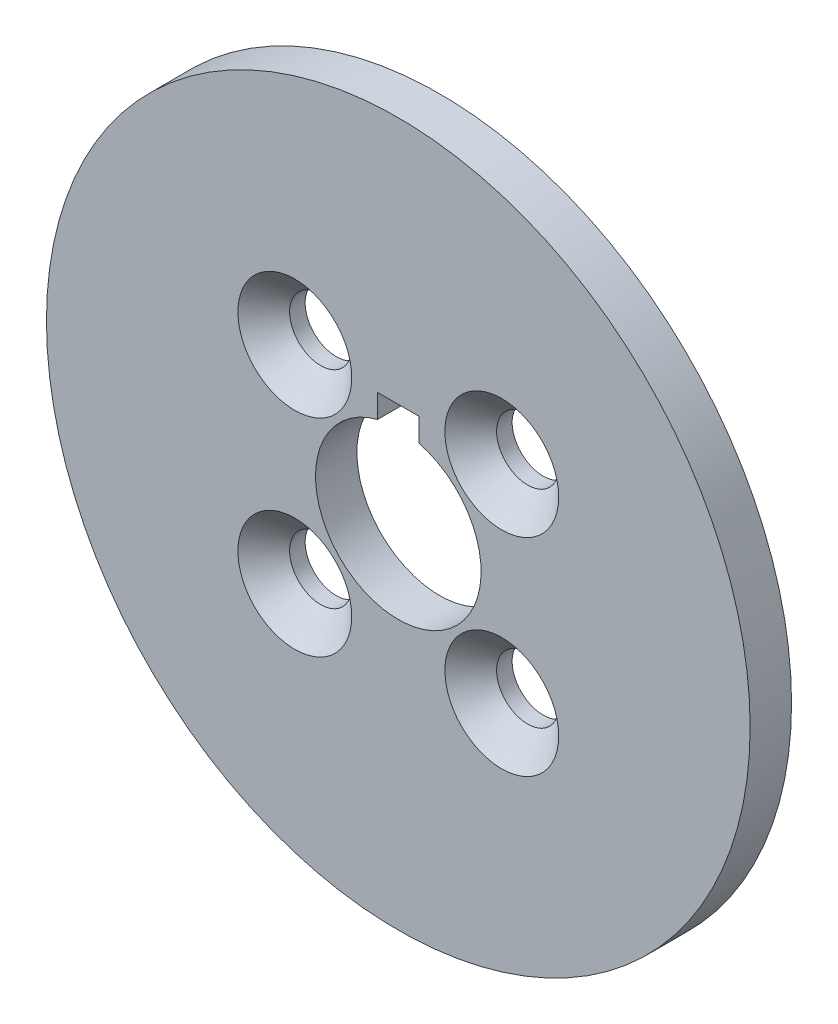
ISO-10303-21;
HEADER;
FILE_DESCRIPTION(('STEP AP214'),'2;1');
FILE_NAME('part.step','',(''),(''),'','','');
FILE_SCHEMA(('AUTOMOTIVE_DESIGN { 1 0 10303 214 1 1 1 1 }'));
ENDSEC;
DATA;
#1=APPLICATION_CONTEXT('core data for automotive mechanical design processes');
#2=APPLICATION_PROTOCOL_DEFINITION('international standard','automotive_design',2000,#1);
#3=PRODUCT_CONTEXT('',#1,'mechanical');
#4=PRODUCT('Part','Part','',(#3));
#5=PRODUCT_RELATED_PRODUCT_CATEGORY('part','',(#4));
#6=PRODUCT_DEFINITION_FORMATION('','',#4);
#7=PRODUCT_DEFINITION_CONTEXT('part definition',#1,'design');
#8=PRODUCT_DEFINITION('design','',#6,#7);
#9=PRODUCT_DEFINITION_SHAPE('','',#8);
#10=(LENGTH_UNIT() NAMED_UNIT(*) SI_UNIT(.MILLI.,.METRE.));
#11=(NAMED_UNIT(*) PLANE_ANGLE_UNIT() SI_UNIT($,.RADIAN.));
#12=(NAMED_UNIT(*) SI_UNIT($,.STERADIAN.) SOLID_ANGLE_UNIT());
#13=UNCERTAINTY_MEASURE_WITH_UNIT(LENGTH_MEASURE(1.E-05),#10,'distance_accuracy_value','');
#14=(GEOMETRIC_REPRESENTATION_CONTEXT(3) GLOBAL_UNCERTAINTY_ASSIGNED_CONTEXT((#13)) GLOBAL_UNIT_ASSIGNED_CONTEXT((#10,
#11,#12)) REPRESENTATION_CONTEXT('',''));
#15=CARTESIAN_POINT('',(0.,0.,0.));
#16=DIRECTION('',(0.,0.,1.));
#17=DIRECTION('',(1.,0.,0.));
#18=AXIS2_PLACEMENT_3D('',#15,#16,#17);
#19=CARTESIAN_POINT('',(0.,0.,2.));
#20=DIRECTION('',(0.,0.,1.));
#21=DIRECTION('',(1.,0.,0.));
#22=AXIS2_PLACEMENT_3D('',#19,#20,#21);
#23=PLANE('',#22);
#24=CARTESIAN_POINT('',(5.00000000000005,-4.99999999999995,2.));
#25=DIRECTION('',(0.,0.,1.));
#26=DIRECTION('',(1.,0.,0.));
#27=AXIS2_PLACEMENT_3D('',#24,#25,#26);
#28=CIRCLE('',#27,2.75);
#29=CARTESIAN_POINT('',(7.75000000000005,-4.99999999999995,2.));
#30=VERTEX_POINT('',#29);
#31=EDGE_CURVE('E223',#30,#30,#28,.T.);
#32=ORIENTED_EDGE('',*,*,#31,.F.);
#33=EDGE_LOOP('',(#32));
#34=FACE_BOUND('',#33,.T.);
#35=CARTESIAN_POINT('',(-5.,-5.,2.));
#36=DIRECTION('',(0.,0.,1.));
#37=DIRECTION('',(1.,0.,0.));
#38=AXIS2_PLACEMENT_3D('',#35,#36,#37);
#39=CIRCLE('',#38,2.75);
#40=CARTESIAN_POINT('',(-2.25,-5.,2.));
#41=VERTEX_POINT('',#40);
#42=EDGE_CURVE('E230',#41,#41,#39,.T.);
#43=ORIENTED_EDGE('',*,*,#42,.F.);
#44=EDGE_LOOP('',(#43));
#45=FACE_BOUND('',#44,.T.);
#46=CARTESIAN_POINT('',(-5.00000000000002,4.99999999999998,2.));
#47=DIRECTION('',(0.,0.,1.));
#48=DIRECTION('',(1.,0.,0.));
#49=AXIS2_PLACEMENT_3D('',#46,#47,#48);
#50=CIRCLE('',#49,2.75);
#51=CARTESIAN_POINT('',(-2.25000000000002,4.99999999999998,2.));
#52=VERTEX_POINT('',#51);
#53=EDGE_CURVE('E239',#52,#52,#50,.T.);
#54=ORIENTED_EDGE('',*,*,#53,.F.);
#55=EDGE_LOOP('',(#54));
#56=FACE_BOUND('',#55,.T.);
#57=CARTESIAN_POINT('',(5.,5.,2.));
#58=DIRECTION('',(0.,0.,1.));
#59=DIRECTION('',(1.,0.,0.));
#60=AXIS2_PLACEMENT_3D('',#57,#58,#59);
#61=CIRCLE('',#60,2.75);
#62=CARTESIAN_POINT('',(7.75,5.,2.));
#63=VERTEX_POINT('',#62);
#64=EDGE_CURVE('E248',#63,#63,#61,.T.);
#65=ORIENTED_EDGE('',*,*,#64,.F.);
#66=EDGE_LOOP('',(#65));
#67=FACE_BOUND('',#66,.T.);
#68=CARTESIAN_POINT('',(0.,0.,2.));
#69=DIRECTION('',(0.,0.,1.));
#70=DIRECTION('',(1.,0.,0.));
#71=AXIS2_PLACEMENT_3D('',#68,#69,#70);
#72=CIRCLE('',#71,17.);
#73=CARTESIAN_POINT('',(17.,0.,2.));
#74=VERTEX_POINT('',#73);
#75=EDGE_CURVE('E11',#74,#74,#72,.T.);
#76=ORIENTED_EDGE('',*,*,#75,.T.);
#77=EDGE_LOOP('',(#76));
#78=FACE_BOUND('',#77,.T.);
#79=DIRECTION('',(0.,1.,0.));
#80=VECTOR('',#79,1.);
#81=CARTESIAN_POINT('',(1.,5.00298334620742,2.));
#82=LINE('',#81,#80);
#83=CARTESIAN_POINT('',(1.,3.87298334620742,2.));
#84=VERTEX_POINT('',#83);
#85=CARTESIAN_POINT('',(1.,5.00298334620742,2.));
#86=VERTEX_POINT('',#85);
#87=EDGE_CURVE('E88',#84,#86,#82,.T.);
#88=ORIENTED_EDGE('',*,*,#87,.F.);
#89=CARTESIAN_POINT('',(0.,0.,2.));
#90=DIRECTION('',(0.,0.,1.));
#91=DIRECTION('',(1.,0.,0.));
#92=AXIS2_PLACEMENT_3D('',#89,#90,#91);
#93=CIRCLE('',#92,4.);
#94=CARTESIAN_POINT('',(-1.,3.87298334620742,2.));
#95=VERTEX_POINT('',#94);
#96=EDGE_CURVE('E80',#95,#84,#93,.T.);
#97=ORIENTED_EDGE('',*,*,#96,.F.);
#98=DIRECTION('',(0.,-1.,0.));
#99=VECTOR('',#98,1.);
#100=CARTESIAN_POINT('',(-1.,3.87298334620742,2.));
#101=LINE('',#100,#99);
#102=CARTESIAN_POINT('',(-1.,5.00298334620742,2.));
#103=VERTEX_POINT('',#102);
#104=EDGE_CURVE('E101',#103,#95,#101,.T.);
#105=ORIENTED_EDGE('',*,*,#104,.F.);
#106=DIRECTION('',(-1.,0.,0.));
#107=VECTOR('',#106,1.);
#108=CARTESIAN_POINT('',(-1.,5.00298334620742,2.));
#109=LINE('',#108,#107);
#110=EDGE_CURVE('E99',#86,#103,#109,.T.);
#111=ORIENTED_EDGE('',*,*,#110,.F.);
#112=EDGE_LOOP('',(#88,#97,#105,#111));
#113=FACE_BOUND('',#112,.T.);
#114=ADVANCED_FACE('F39',(#34,#45,#56,#67,#78,#113),#23,.T.);
#115=CARTESIAN_POINT('',(0.,0.,0.));
#116=DIRECTION('',(0.,0.,1.));
#117=DIRECTION('',(1.,0.,0.));
#118=AXIS2_PLACEMENT_3D('',#115,#116,#117);
#119=PLANE('',#118);
#120=CARTESIAN_POINT('',(5.00000000000005,-4.99999999999995,0.));
#121=DIRECTION('',(0.,0.,1.));
#122=DIRECTION('',(1.,0.,0.));
#123=AXIS2_PLACEMENT_3D('',#120,#121,#122);
#124=CIRCLE('',#123,1.5);
#125=CARTESIAN_POINT('',(6.50000000000005,-4.99999999999995,0.));
#126=VERTEX_POINT('',#125);
#127=EDGE_CURVE('E225',#126,#126,#124,.T.);
#128=ORIENTED_EDGE('',*,*,#127,.T.);
#129=EDGE_LOOP('',(#128));
#130=FACE_BOUND('',#129,.T.);
#131=CARTESIAN_POINT('',(-5.,-5.,0.));
#132=DIRECTION('',(0.,0.,1.));
#133=DIRECTION('',(1.,0.,0.));
#134=AXIS2_PLACEMENT_3D('',#131,#132,#133);
#135=CIRCLE('',#134,1.5);
#136=CARTESIAN_POINT('',(-3.5,-5.,0.));
#137=VERTEX_POINT('',#136);
#138=EDGE_CURVE('E236',#137,#137,#135,.T.);
#139=ORIENTED_EDGE('',*,*,#138,.T.);
#140=EDGE_LOOP('',(#139));
#141=FACE_BOUND('',#140,.T.);
#142=CARTESIAN_POINT('',(-5.00000000000002,4.99999999999998,0.));
#143=DIRECTION('',(0.,0.,1.));
#144=DIRECTION('',(1.,0.,0.));
#145=AXIS2_PLACEMENT_3D('',#142,#143,#144);
#146=CIRCLE('',#145,1.5);
#147=CARTESIAN_POINT('',(-3.50000000000002,4.99999999999998,0.));
#148=VERTEX_POINT('',#147);
#149=EDGE_CURVE('E245',#148,#148,#146,.T.);
#150=ORIENTED_EDGE('',*,*,#149,.T.);
#151=EDGE_LOOP('',(#150));
#152=FACE_BOUND('',#151,.T.);
#153=CARTESIAN_POINT('',(5.,5.,0.));
#154=DIRECTION('',(0.,0.,1.));
#155=DIRECTION('',(1.,0.,0.));
#156=AXIS2_PLACEMENT_3D('',#153,#154,#155);
#157=CIRCLE('',#156,1.5);
#158=CARTESIAN_POINT('',(6.5,5.,0.));
#159=VERTEX_POINT('',#158);
#160=EDGE_CURVE('E107',#159,#159,#157,.T.);
#161=ORIENTED_EDGE('',*,*,#160,.T.);
#162=EDGE_LOOP('',(#161));
#163=FACE_BOUND('',#162,.T.);
#164=CARTESIAN_POINT('',(0.,0.,0.));
#165=DIRECTION('',(0.,0.,1.));
#166=DIRECTION('',(1.,0.,0.));
#167=AXIS2_PLACEMENT_3D('',#164,#165,#166);
#168=CIRCLE('',#167,17.);
#169=CARTESIAN_POINT('',(17.,0.,0.));
#170=VERTEX_POINT('',#169);
#171=EDGE_CURVE('E43',#170,#170,#168,.T.);
#172=ORIENTED_EDGE('',*,*,#171,.F.);
#173=EDGE_LOOP('',(#172));
#174=FACE_BOUND('',#173,.T.);
#175=CARTESIAN_POINT('',(0.,0.,0.));
#176=DIRECTION('',(0.,0.,1.));
#177=DIRECTION('',(1.,0.,0.));
#178=AXIS2_PLACEMENT_3D('',#175,#176,#177);
#179=CIRCLE('',#178,4.);
#180=CARTESIAN_POINT('',(-1.,3.87298334620742,0.));
#181=VERTEX_POINT('',#180);
#182=CARTESIAN_POINT('',(1.,3.87298334620742,0.));
#183=VERTEX_POINT('',#182);
#184=EDGE_CURVE('E62',#181,#183,#179,.T.);
#185=ORIENTED_EDGE('',*,*,#184,.T.);
#186=DIRECTION('',(0.,1.,0.));
#187=VECTOR('',#186,1.);
#188=CARTESIAN_POINT('',(1.,5.00298334620742,0.));
#189=LINE('',#188,#187);
#190=CARTESIAN_POINT('',(1.,5.00298334620742,0.));
#191=VERTEX_POINT('',#190);
#192=EDGE_CURVE('E95',#183,#191,#189,.T.);
#193=ORIENTED_EDGE('',*,*,#192,.T.);
#194=DIRECTION('',(-1.,0.,0.));
#195=VECTOR('',#194,1.);
#196=CARTESIAN_POINT('',(-1.,5.00298334620742,0.));
#197=LINE('',#196,#195);
#198=CARTESIAN_POINT('',(-1.,5.00298334620742,0.));
#199=VERTEX_POINT('',#198);
#200=EDGE_CURVE('E109',#191,#199,#197,.T.);
#201=ORIENTED_EDGE('',*,*,#200,.T.);
#202=DIRECTION('',(0.,-1.,0.));
#203=VECTOR('',#202,1.);
#204=CARTESIAN_POINT('',(-1.,3.87298334620742,0.));
#205=LINE('',#204,#203);
#206=EDGE_CURVE('E89',#199,#181,#205,.T.);
#207=ORIENTED_EDGE('',*,*,#206,.T.);
#208=EDGE_LOOP('',(#185,#193,#201,#207));
#209=FACE_BOUND('',#208,.T.);
#210=ADVANCED_FACE('F120',(#130,#141,#152,#163,#174,#209),#119,.F.);
#211=CARTESIAN_POINT('',(0.,0.,2.));
#212=DIRECTION('',(0.,0.,-1.));
#213=DIRECTION('',(-1.,0.,0.));
#214=AXIS2_PLACEMENT_3D('',#211,#212,#213);
#215=CYLINDRICAL_SURFACE('',#214,17.);
#216=ORIENTED_EDGE('',*,*,#75,.F.);
#217=EDGE_LOOP('',(#216));
#218=FACE_BOUND('',#217,.T.);
#219=ORIENTED_EDGE('',*,*,#171,.T.);
#220=EDGE_LOOP('',(#219));
#221=FACE_BOUND('',#220,.T.);
#222=ADVANCED_FACE('F41',(#218,#221),#215,.T.);
#223=CARTESIAN_POINT('',(0.,0.,2.));
#224=DIRECTION('',(0.,0.,-1.));
#225=DIRECTION('',(-1.,0.,0.));
#226=AXIS2_PLACEMENT_3D('',#223,#224,#225);
#227=CYLINDRICAL_SURFACE('',#226,4.);
#228=ORIENTED_EDGE('',*,*,#184,.F.);
#229=DIRECTION('',(0.,0.,-1.));
#230=VECTOR('',#229,1.);
#231=CARTESIAN_POINT('',(-1.,3.87298334620742,2.));
#232=LINE('',#231,#230);
#233=EDGE_CURVE('E84',#95,#181,#232,.T.);
#234=ORIENTED_EDGE('',*,*,#233,.F.);
#235=ORIENTED_EDGE('',*,*,#96,.T.);
#236=DIRECTION('',(0.,0.,-1.));
#237=VECTOR('',#236,1.);
#238=CARTESIAN_POINT('',(1.,3.87298334620742,2.));
#239=LINE('',#238,#237);
#240=EDGE_CURVE('E83',#84,#183,#239,.T.);
#241=ORIENTED_EDGE('',*,*,#240,.T.);
#242=EDGE_LOOP('',(#228,#234,#235,#241));
#243=FACE_BOUND('',#242,.T.);
#244=ADVANCED_FACE('F82',(#243),#227,.F.);
#245=CARTESIAN_POINT('',(1.,5.00298334620742,2.));
#246=DIRECTION('',(-1.,0.,0.));
#247=DIRECTION('',(0.,0.,1.));
#248=AXIS2_PLACEMENT_3D('',#245,#246,#247);
#249=PLANE('',#248);
#250=ORIENTED_EDGE('',*,*,#192,.F.);
#251=ORIENTED_EDGE('',*,*,#240,.F.);
#252=ORIENTED_EDGE('',*,*,#87,.T.);
#253=DIRECTION('',(0.,0.,-1.));
#254=VECTOR('',#253,1.);
#255=CARTESIAN_POINT('',(1.,5.00298334620742,2.));
#256=LINE('',#255,#254);
#257=EDGE_CURVE('E96',#86,#191,#256,.T.);
#258=ORIENTED_EDGE('',*,*,#257,.T.);
#259=EDGE_LOOP('',(#250,#251,#252,#258));
#260=FACE_BOUND('',#259,.T.);
#261=ADVANCED_FACE('F92',(#260),#249,.T.);
#262=CARTESIAN_POINT('',(-1.,5.00298334620742,2.));
#263=DIRECTION('',(0.,-1.,0.));
#264=DIRECTION('',(1.,0.,0.));
#265=AXIS2_PLACEMENT_3D('',#262,#263,#264);
#266=PLANE('',#265);
#267=ORIENTED_EDGE('',*,*,#200,.F.);
#268=ORIENTED_EDGE('',*,*,#257,.F.);
#269=ORIENTED_EDGE('',*,*,#110,.T.);
#270=DIRECTION('',(0.,0.,-1.));
#271=VECTOR('',#270,1.);
#272=CARTESIAN_POINT('',(-1.,5.00298334620742,2.));
#273=LINE('',#272,#271);
#274=EDGE_CURVE('E54',#103,#199,#273,.T.);
#275=ORIENTED_EDGE('',*,*,#274,.T.);
#276=EDGE_LOOP('',(#267,#268,#269,#275));
#277=FACE_BOUND('',#276,.T.);
#278=ADVANCED_FACE('F118',(#277),#266,.T.);
#279=CARTESIAN_POINT('',(-1.,3.87298334620742,2.));
#280=DIRECTION('',(1.,0.,0.));
#281=DIRECTION('',(0.,1.,0.));
#282=AXIS2_PLACEMENT_3D('',#279,#280,#281);
#283=PLANE('',#282);
#284=ORIENTED_EDGE('',*,*,#206,.F.);
#285=ORIENTED_EDGE('',*,*,#274,.F.);
#286=ORIENTED_EDGE('',*,*,#104,.T.);
#287=ORIENTED_EDGE('',*,*,#233,.T.);
#288=EDGE_LOOP('',(#284,#285,#286,#287));
#289=FACE_BOUND('',#288,.T.);
#290=ADVANCED_FACE('F121',(#289),#283,.T.);
#291=CARTESIAN_POINT('',(5.,5.,2.));
#292=DIRECTION('',(0.,0.,1.));
#293=DIRECTION('',(1.,0.,0.));
#294=AXIS2_PLACEMENT_3D('',#291,#292,#293);
#295=CYLINDRICAL_SURFACE('',#294,1.5);
#296=ORIENTED_EDGE('',*,*,#160,.F.);
#297=EDGE_LOOP('',(#296));
#298=FACE_BOUND('',#297,.T.);
#299=CARTESIAN_POINT('',(5.,5.,0.750000000000001));
#300=DIRECTION('',(0.,0.,1.));
#301=DIRECTION('',(1.,0.,0.));
#302=AXIS2_PLACEMENT_3D('',#299,#300,#301);
#303=CIRCLE('',#302,1.5);
#304=CARTESIAN_POINT('',(6.5,5.,0.750000000000001));
#305=VERTEX_POINT('',#304);
#306=EDGE_CURVE('E251',#305,#305,#303,.T.);
#307=ORIENTED_EDGE('',*,*,#306,.T.);
#308=EDGE_LOOP('',(#307));
#309=FACE_BOUND('',#308,.T.);
#310=ADVANCED_FACE('F123',(#298,#309),#295,.F.);
#311=CARTESIAN_POINT('',(5.,5.,2.));
#312=DIRECTION('',(0.,0.,1.));
#313=DIRECTION('',(1.,0.,0.));
#314=AXIS2_PLACEMENT_3D('',#311,#312,#313);
#315=CONICAL_SURFACE('',#314,2.75,0.785398163397449);
#316=ORIENTED_EDGE('',*,*,#306,.F.);
#317=EDGE_LOOP('',(#316));
#318=FACE_BOUND('',#317,.T.);
#319=ORIENTED_EDGE('',*,*,#64,.T.);
#320=EDGE_LOOP('',(#319));
#321=FACE_BOUND('',#320,.T.);
#322=ADVANCED_FACE('F129',(#318,#321),#315,.F.);
#323=CARTESIAN_POINT('',(-5.00000000000002,4.99999999999998,2.));
#324=DIRECTION('',(0.,0.,1.));
#325=DIRECTION('',(1.,0.,0.));
#326=AXIS2_PLACEMENT_3D('',#323,#324,#325);
#327=CYLINDRICAL_SURFACE('',#326,1.5);
#328=ORIENTED_EDGE('',*,*,#149,.F.);
#329=EDGE_LOOP('',(#328));
#330=FACE_BOUND('',#329,.T.);
#331=CARTESIAN_POINT('',(-5.00000000000002,4.99999999999998,0.750000000000001));
#332=DIRECTION('',(0.,0.,1.));
#333=DIRECTION('',(1.,0.,0.));
#334=AXIS2_PLACEMENT_3D('',#331,#332,#333);
#335=CIRCLE('',#334,1.5);
#336=CARTESIAN_POINT('',(-3.50000000000002,4.99999999999998,0.750000000000001));
#337=VERTEX_POINT('',#336);
#338=EDGE_CURVE('E242',#337,#337,#335,.T.);
#339=ORIENTED_EDGE('',*,*,#338,.T.);
#340=EDGE_LOOP('',(#339));
#341=FACE_BOUND('',#340,.T.);
#342=ADVANCED_FACE('F168',(#330,#341),#327,.F.);
#343=CARTESIAN_POINT('',(-5.00000000000002,4.99999999999998,2.));
#344=DIRECTION('',(0.,0.,1.));
#345=DIRECTION('',(1.,0.,0.));
#346=AXIS2_PLACEMENT_3D('',#343,#344,#345);
#347=CONICAL_SURFACE('',#346,2.75,0.785398163397449);
#348=ORIENTED_EDGE('',*,*,#338,.F.);
#349=EDGE_LOOP('',(#348));
#350=FACE_BOUND('',#349,.T.);
#351=ORIENTED_EDGE('',*,*,#53,.T.);
#352=EDGE_LOOP('',(#351));
#353=FACE_BOUND('',#352,.T.);
#354=ADVANCED_FACE('F176',(#350,#353),#347,.F.);
#355=CARTESIAN_POINT('',(-5.,-5.,2.));
#356=DIRECTION('',(0.,0.,1.));
#357=DIRECTION('',(1.,0.,0.));
#358=AXIS2_PLACEMENT_3D('',#355,#356,#357);
#359=CYLINDRICAL_SURFACE('',#358,1.5);
#360=ORIENTED_EDGE('',*,*,#138,.F.);
#361=EDGE_LOOP('',(#360));
#362=FACE_BOUND('',#361,.T.);
#363=CARTESIAN_POINT('',(-5.,-5.,0.750000000000001));
#364=DIRECTION('',(0.,0.,1.));
#365=DIRECTION('',(1.,0.,0.));
#366=AXIS2_PLACEMENT_3D('',#363,#364,#365);
#367=CIRCLE('',#366,1.5);
#368=CARTESIAN_POINT('',(-3.5,-5.,0.750000000000001));
#369=VERTEX_POINT('',#368);
#370=EDGE_CURVE('E233',#369,#369,#367,.T.);
#371=ORIENTED_EDGE('',*,*,#370,.T.);
#372=EDGE_LOOP('',(#371));
#373=FACE_BOUND('',#372,.T.);
#374=ADVANCED_FACE('F184',(#362,#373),#359,.F.);
#375=CARTESIAN_POINT('',(-5.,-5.,2.));
#376=DIRECTION('',(0.,0.,1.));
#377=DIRECTION('',(1.,0.,0.));
#378=AXIS2_PLACEMENT_3D('',#375,#376,#377);
#379=CONICAL_SURFACE('',#378,2.75,0.785398163397449);
#380=ORIENTED_EDGE('',*,*,#370,.F.);
#381=EDGE_LOOP('',(#380));
#382=FACE_BOUND('',#381,.T.);
#383=ORIENTED_EDGE('',*,*,#42,.T.);
#384=EDGE_LOOP('',(#383));
#385=FACE_BOUND('',#384,.T.);
#386=ADVANCED_FACE('F192',(#382,#385),#379,.F.);
#387=CARTESIAN_POINT('',(5.00000000000005,-4.99999999999995,2.));
#388=DIRECTION('',(0.,0.,1.));
#389=DIRECTION('',(1.,0.,0.));
#390=AXIS2_PLACEMENT_3D('',#387,#388,#389);
#391=CYLINDRICAL_SURFACE('',#390,1.5);
#392=ORIENTED_EDGE('',*,*,#127,.F.);
#393=EDGE_LOOP('',(#392));
#394=FACE_BOUND('',#393,.T.);
#395=CARTESIAN_POINT('',(5.00000000000005,-4.99999999999995,0.750000000000001));
#396=DIRECTION('',(0.,0.,1.));
#397=DIRECTION('',(1.,0.,0.));
#398=AXIS2_PLACEMENT_3D('',#395,#396,#397);
#399=CIRCLE('',#398,1.5);
#400=CARTESIAN_POINT('',(6.50000000000005,-4.99999999999995,0.750000000000001));
#401=VERTEX_POINT('',#400);
#402=EDGE_CURVE('E221',#401,#401,#399,.T.);
#403=ORIENTED_EDGE('',*,*,#402,.T.);
#404=EDGE_LOOP('',(#403));
#405=FACE_BOUND('',#404,.T.);
#406=ADVANCED_FACE('F200',(#394,#405),#391,.F.);
#407=CARTESIAN_POINT('',(5.00000000000005,-4.99999999999995,2.));
#408=DIRECTION('',(0.,0.,1.));
#409=DIRECTION('',(1.,0.,0.));
#410=AXIS2_PLACEMENT_3D('',#407,#408,#409);
#411=CONICAL_SURFACE('',#410,2.75,0.785398163397449);
#412=ORIENTED_EDGE('',*,*,#402,.F.);
#413=EDGE_LOOP('',(#412));
#414=FACE_BOUND('',#413,.T.);
#415=ORIENTED_EDGE('',*,*,#31,.T.);
#416=EDGE_LOOP('',(#415));
#417=FACE_BOUND('',#416,.T.);
#418=ADVANCED_FACE('F208',(#414,#417),#411,.F.);
#419=CLOSED_SHELL('',(#114,#210,#222,#244,#261,#278,#290,#310,#322,#342,#354,#374,#386,#406,#418));
#420=MANIFOLD_SOLID_BREP('B2',#419);
#421=ADVANCED_BREP_SHAPE_REPRESENTATION('',(#18,#420),#14);
#422=SHAPE_DEFINITION_REPRESENTATION(#9,#421);
ENDSEC;
END-ISO-10303-21;
